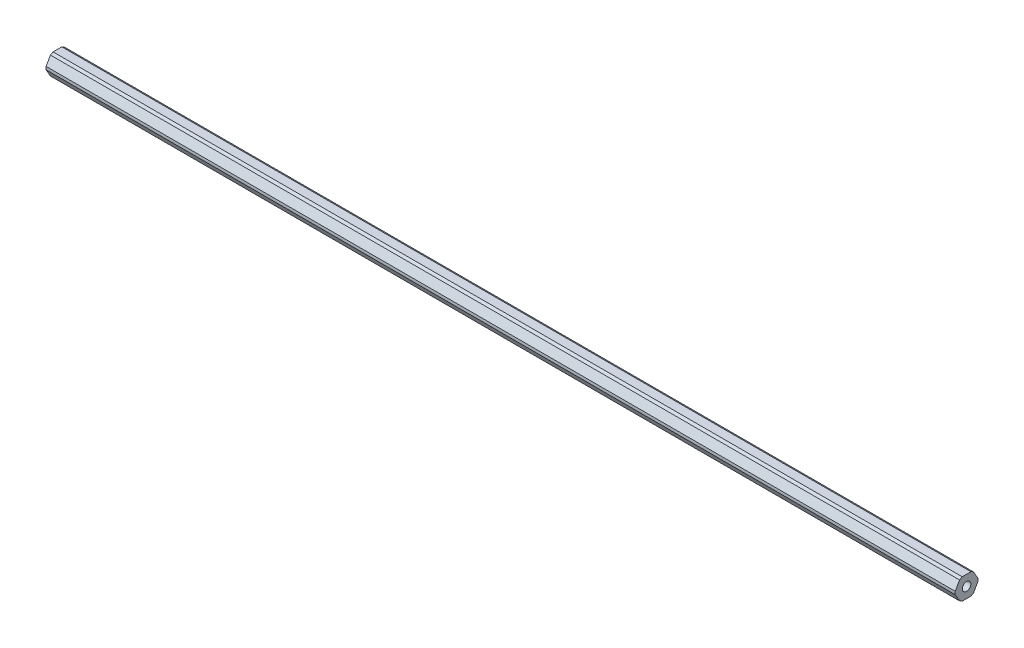
ISO-10303-21;
HEADER;
FILE_DESCRIPTION(('STEP AP214'),'2;1');
FILE_NAME('part.step','',(''),(''),'','','');
FILE_SCHEMA(('AUTOMOTIVE_DESIGN { 1 0 10303 214 1 1 1 1 }'));
ENDSEC;
DATA;
#1=APPLICATION_CONTEXT('core data for automotive mechanical design processes');
#2=APPLICATION_PROTOCOL_DEFINITION('international standard','automotive_design',2000,#1);
#3=PRODUCT_CONTEXT('',#1,'mechanical');
#4=PRODUCT('Part','Part','',(#3));
#5=PRODUCT_RELATED_PRODUCT_CATEGORY('part','',(#4));
#6=PRODUCT_DEFINITION_FORMATION('','',#4);
#7=PRODUCT_DEFINITION_CONTEXT('part definition',#1,'design');
#8=PRODUCT_DEFINITION('design','',#6,#7);
#9=PRODUCT_DEFINITION_SHAPE('','',#8);
#10=(LENGTH_UNIT() NAMED_UNIT(*) SI_UNIT(.MILLI.,.METRE.));
#11=(NAMED_UNIT(*) PLANE_ANGLE_UNIT() SI_UNIT($,.RADIAN.));
#12=(NAMED_UNIT(*) SI_UNIT($,.STERADIAN.) SOLID_ANGLE_UNIT());
#13=UNCERTAINTY_MEASURE_WITH_UNIT(LENGTH_MEASURE(1.E-05),#10,'distance_accuracy_value','');
#14=(GEOMETRIC_REPRESENTATION_CONTEXT(3) GLOBAL_UNCERTAINTY_ASSIGNED_CONTEXT((#13)) GLOBAL_UNIT_ASSIGNED_CONTEXT((#10,
#11,#12)) REPRESENTATION_CONTEXT('',''));
#15=CARTESIAN_POINT('',(0.,0.,0.));
#16=DIRECTION('',(0.,0.,1.));
#17=DIRECTION('',(1.,0.,0.));
#18=AXIS2_PLACEMENT_3D('',#15,#16,#17);
#19=CARTESIAN_POINT('',(635.,-92.0747265172785,1137.500265));
#20=DIRECTION('',(0.,-0.500000000000007,0.866025403784435));
#21=DIRECTION('',(0.,-0.866025403784435,-0.500000000000006));
#22=AXIS2_PLACEMENT_3D('',#19,#20,#21);
#23=PLANE('',#22);
#24=DIRECTION('',(-1.,0.,0.));
#25=VECTOR('',#24,1.);
#26=CARTESIAN_POINT('',(635.,-94.3555451597346,1136.18343374281));
#27=LINE('',#26,#25);
#28=CARTESIAN_POINT('',(635.,-94.3555451597345,1136.18343374281));
#29=VERTEX_POINT('',#28);
#30=CARTESIAN_POINT('',(88.9,-94.3555451597346,1136.18343374281));
#31=VERTEX_POINT('',#30);
#32=EDGE_CURVE('E164',#29,#31,#27,.T.);
#33=ORIENTED_EDGE('',*,*,#32,.T.);
#34=DIRECTION('',(0.,-0.866025403784435,-0.500000000000007));
#35=VECTOR('',#34,1.);
#36=CARTESIAN_POINT('',(88.9,-92.0747265172785,1137.500265));
#37=LINE('',#36,#35);
#38=CARTESIAN_POINT('',(88.9,-89.7939078748223,1138.81709625719));
#39=VERTEX_POINT('',#38);
#40=EDGE_CURVE('E135',#39,#31,#37,.T.);
#41=ORIENTED_EDGE('',*,*,#40,.F.);
#42=DIRECTION('',(-1.,0.,0.));
#43=VECTOR('',#42,1.);
#44=CARTESIAN_POINT('',(635.,-89.7939078748223,1138.81709625719));
#45=LINE('',#44,#43);
#46=CARTESIAN_POINT('',(635.,-89.7939078748223,1138.81709625719));
#47=VERTEX_POINT('',#46);
#48=EDGE_CURVE('E166',#39,#47,#45,.F.);
#49=ORIENTED_EDGE('',*,*,#48,.T.);
#50=DIRECTION('',(0.,0.866025403784435,0.500000000000007));
#51=VECTOR('',#50,1.);
#52=CARTESIAN_POINT('',(635.,-92.0747265172785,1137.500265));
#53=LINE('',#52,#51);
#54=EDGE_CURVE('E172',#29,#47,#53,.T.);
#55=ORIENTED_EDGE('',*,*,#54,.F.);
#56=EDGE_LOOP('',(#33,#41,#49,#55));
#57=FACE_BOUND('',#56,.T.);
#58=ADVANCED_FACE('F17',(#57),#23,.F.);
#59=CARTESIAN_POINT('',(635.,-88.8994530345568,1143.));
#60=DIRECTION('',(0.,-1.,0.));
#61=DIRECTION('',(0.,0.,-1.));
#62=AXIS2_PLACEMENT_3D('',#59,#60,#61);
#63=PLANE('',#62);
#64=DIRECTION('',(-1.,0.,0.));
#65=VECTOR('',#64,1.);
#66=CARTESIAN_POINT('',(635.,-88.8994530345568,1140.36633748561));
#67=LINE('',#66,#65);
#68=CARTESIAN_POINT('',(635.,-88.8994530345568,1140.36633748561));
#69=VERTEX_POINT('',#68);
#70=CARTESIAN_POINT('',(88.9,-88.8994530345568,1140.36633748561));
#71=VERTEX_POINT('',#70);
#72=EDGE_CURVE('E116',#69,#71,#67,.T.);
#73=ORIENTED_EDGE('',*,*,#72,.T.);
#74=DIRECTION('',(0.,0.,-1.));
#75=VECTOR('',#74,1.);
#76=CARTESIAN_POINT('',(88.9,-88.8994530345568,1143.));
#77=LINE('',#76,#75);
#78=CARTESIAN_POINT('',(88.9,-88.8994530345568,1145.63366251439));
#79=VERTEX_POINT('',#78);
#80=EDGE_CURVE('E132',#79,#71,#77,.T.);
#81=ORIENTED_EDGE('',*,*,#80,.F.);
#82=DIRECTION('',(-1.,0.,0.));
#83=VECTOR('',#82,1.);
#84=CARTESIAN_POINT('',(635.,-88.8994530345568,1145.63366251439));
#85=LINE('',#84,#83);
#86=CARTESIAN_POINT('',(635.,-88.8994530345568,1145.63366251439));
#87=VERTEX_POINT('',#86);
#88=EDGE_CURVE('E161',#79,#87,#85,.F.);
#89=ORIENTED_EDGE('',*,*,#88,.T.);
#90=DIRECTION('',(0.,0.,1.));
#91=VECTOR('',#90,1.);
#92=CARTESIAN_POINT('',(635.,-88.8994530345568,1143.));
#93=LINE('',#92,#91);
#94=EDGE_CURVE('E175',#69,#87,#93,.T.);
#95=ORIENTED_EDGE('',*,*,#94,.F.);
#96=EDGE_LOOP('',(#73,#81,#89,#95));
#97=FACE_BOUND('',#96,.T.);
#98=ADVANCED_FACE('F225',(#97),#63,.F.);
#99=CARTESIAN_POINT('',(635.,-92.0747265172784,1148.499735));
#100=DIRECTION('',(0.,-0.500000000000007,-0.866025403784435));
#101=DIRECTION('',(0.,0.866025403784435,-0.500000000000006));
#102=AXIS2_PLACEMENT_3D('',#99,#100,#101);
#103=PLANE('',#102);
#104=DIRECTION('',(-1.,0.,0.));
#105=VECTOR('',#104,1.);
#106=CARTESIAN_POINT('',(635.,-89.7939078748227,1147.18290374281));
#107=LINE('',#106,#105);
#108=CARTESIAN_POINT('',(635.,-89.7939078748227,1147.18290374281));
#109=VERTEX_POINT('',#108);
#110=CARTESIAN_POINT('',(88.9,-89.7939078748227,1147.18290374281));
#111=VERTEX_POINT('',#110);
#112=EDGE_CURVE('E117',#109,#111,#107,.T.);
#113=ORIENTED_EDGE('',*,*,#112,.T.);
#114=DIRECTION('',(0.,0.866025403784435,-0.500000000000007));
#115=VECTOR('',#114,1.);
#116=CARTESIAN_POINT('',(88.9,-92.0747265172784,1148.499735));
#117=LINE('',#116,#115);
#118=CARTESIAN_POINT('',(88.9,-94.355545159734,1149.81656625719));
#119=VERTEX_POINT('',#118);
#120=EDGE_CURVE('E123',#119,#111,#117,.T.);
#121=ORIENTED_EDGE('',*,*,#120,.F.);
#122=DIRECTION('',(-1.,0.,0.));
#123=VECTOR('',#122,1.);
#124=CARTESIAN_POINT('',(635.,-94.355545159734,1149.81656625719));
#125=LINE('',#124,#123);
#126=CARTESIAN_POINT('',(635.,-94.355545159734,1149.81656625719));
#127=VERTEX_POINT('',#126);
#128=EDGE_CURVE('E105',#119,#127,#125,.F.);
#129=ORIENTED_EDGE('',*,*,#128,.T.);
#130=DIRECTION('',(0.,-0.866025403784435,0.500000000000007));
#131=VECTOR('',#130,1.);
#132=CARTESIAN_POINT('',(635.,-92.0747265172784,1148.499735));
#133=LINE('',#132,#131);
#134=EDGE_CURVE('E178',#109,#127,#133,.T.);
#135=ORIENTED_EDGE('',*,*,#134,.F.);
#136=EDGE_LOOP('',(#113,#121,#129,#135));
#137=FACE_BOUND('',#136,.T.);
#138=ADVANCED_FACE('F130',(#137),#103,.F.);
#139=CARTESIAN_POINT('',(635.,-98.4252734827217,1148.499735));
#140=DIRECTION('',(0.,0.500000000000007,-0.866025403784435));
#141=DIRECTION('',(0.,0.866025403784435,0.500000000000006));
#142=AXIS2_PLACEMENT_3D('',#139,#140,#141);
#143=PLANE('',#142);
#144=DIRECTION('',(-1.,0.,0.));
#145=VECTOR('',#144,1.);
#146=CARTESIAN_POINT('',(635.,-96.1444548402661,1149.81656625719));
#147=LINE('',#146,#145);
#148=CARTESIAN_POINT('',(635.,-96.144454840266,1149.81656625719));
#149=VERTEX_POINT('',#148);
#150=CARTESIAN_POINT('',(88.9,-96.144454840266,1149.81656625719));
#151=VERTEX_POINT('',#150);
#152=EDGE_CURVE('E154',#149,#151,#147,.T.);
#153=ORIENTED_EDGE('',*,*,#152,.T.);
#154=DIRECTION('',(0.,0.866025403784435,0.500000000000007));
#155=VECTOR('',#154,1.);
#156=CARTESIAN_POINT('',(88.9,-98.4252734827217,1148.499735));
#157=LINE('',#156,#155);
#158=CARTESIAN_POINT('',(88.9,-100.706092125177,1147.18290374281));
#159=VERTEX_POINT('',#158);
#160=EDGE_CURVE('E126',#159,#151,#157,.T.);
#161=ORIENTED_EDGE('',*,*,#160,.F.);
#162=DIRECTION('',(-1.,0.,0.));
#163=VECTOR('',#162,1.);
#164=CARTESIAN_POINT('',(635.,-100.706092125177,1147.18290374281));
#165=LINE('',#164,#163);
#166=CARTESIAN_POINT('',(635.,-100.706092125177,1147.18290374281));
#167=VERTEX_POINT('',#166);
#168=EDGE_CURVE('E156',#159,#167,#165,.F.);
#169=ORIENTED_EDGE('',*,*,#168,.T.);
#170=DIRECTION('',(0.,-0.866025403784435,-0.500000000000007));
#171=VECTOR('',#170,1.);
#172=CARTESIAN_POINT('',(635.,-98.4252734827217,1148.499735));
#173=LINE('',#172,#171);
#174=EDGE_CURVE('E180',#149,#167,#173,.T.);
#175=ORIENTED_EDGE('',*,*,#174,.F.);
#176=EDGE_LOOP('',(#153,#161,#169,#175));
#177=FACE_BOUND('',#176,.T.);
#178=ADVANCED_FACE('F230',(#177),#143,.F.);
#179=CARTESIAN_POINT('',(635.,-101.600546965443,1143.));
#180=DIRECTION('',(0.,1.,0.));
#181=DIRECTION('',(0.,0.,1.));
#182=AXIS2_PLACEMENT_3D('',#179,#180,#181);
#183=PLANE('',#182);
#184=DIRECTION('',(-1.,0.,0.));
#185=VECTOR('',#184,1.);
#186=CARTESIAN_POINT('',(635.,-101.600546965443,1145.63366251439));
#187=LINE('',#186,#185);
#188=CARTESIAN_POINT('',(635.,-101.600546965443,1145.63366251439));
#189=VERTEX_POINT('',#188);
#190=CARTESIAN_POINT('',(88.9,-101.600546965443,1145.63366251439));
#191=VERTEX_POINT('',#190);
#192=EDGE_CURVE('E149',#189,#191,#187,.T.);
#193=ORIENTED_EDGE('',*,*,#192,.T.);
#194=DIRECTION('',(0.,0.,1.));
#195=VECTOR('',#194,1.);
#196=CARTESIAN_POINT('',(88.9,-101.600546965443,1143.));
#197=LINE('',#196,#195);
#198=CARTESIAN_POINT('',(88.9,-101.600546965443,1140.36633748561));
#199=VERTEX_POINT('',#198);
#200=EDGE_CURVE('E137',#199,#191,#197,.T.);
#201=ORIENTED_EDGE('',*,*,#200,.F.);
#202=DIRECTION('',(-1.,0.,0.));
#203=VECTOR('',#202,1.);
#204=CARTESIAN_POINT('',(635.,-101.600546965443,1140.36633748561));
#205=LINE('',#204,#203);
#206=CARTESIAN_POINT('',(635.,-101.600546965443,1140.36633748561));
#207=VERTEX_POINT('',#206);
#208=EDGE_CURVE('E151',#199,#207,#205,.F.);
#209=ORIENTED_EDGE('',*,*,#208,.T.);
#210=DIRECTION('',(0.,0.,-1.));
#211=VECTOR('',#210,1.);
#212=CARTESIAN_POINT('',(635.,-101.600546965443,1143.));
#213=LINE('',#212,#211);
#214=EDGE_CURVE('E24',#189,#207,#213,.T.);
#215=ORIENTED_EDGE('',*,*,#214,.F.);
#216=EDGE_LOOP('',(#193,#201,#209,#215));
#217=FACE_BOUND('',#216,.T.);
#218=ADVANCED_FACE('F190',(#217),#183,.F.);
#219=CARTESIAN_POINT('',(635.,-98.4252734827216,1137.500265));
#220=DIRECTION('',(0.,0.500000000000007,0.866025403784435));
#221=DIRECTION('',(0.,-0.866025403784435,0.500000000000006));
#222=AXIS2_PLACEMENT_3D('',#219,#220,#221);
#223=PLANE('',#222);
#224=DIRECTION('',(-1.,0.,0.));
#225=VECTOR('',#224,1.);
#226=CARTESIAN_POINT('',(635.,-100.706092125178,1138.81709625719));
#227=LINE('',#226,#225);
#228=CARTESIAN_POINT('',(635.,-100.706092125178,1138.81709625719));
#229=VERTEX_POINT('',#228);
#230=CARTESIAN_POINT('',(88.9,-100.706092125178,1138.81709625719));
#231=VERTEX_POINT('',#230);
#232=EDGE_CURVE('E39',#229,#231,#227,.T.);
#233=ORIENTED_EDGE('',*,*,#232,.T.);
#234=DIRECTION('',(0.,-0.866025403784435,0.500000000000007));
#235=VECTOR('',#234,1.);
#236=CARTESIAN_POINT('',(88.9,-98.4252734827216,1137.500265));
#237=LINE('',#236,#235);
#238=CARTESIAN_POINT('',(88.9,-96.1444548402655,1136.18343374281));
#239=VERTEX_POINT('',#238);
#240=EDGE_CURVE('E200',#239,#231,#237,.T.);
#241=ORIENTED_EDGE('',*,*,#240,.F.);
#242=DIRECTION('',(-1.,0.,0.));
#243=VECTOR('',#242,1.);
#244=CARTESIAN_POINT('',(635.,-96.1444548402655,1136.18343374281));
#245=LINE('',#244,#243);
#246=CARTESIAN_POINT('',(635.,-96.1444548402655,1136.18343374281));
#247=VERTEX_POINT('',#246);
#248=EDGE_CURVE('E147',#239,#247,#245,.F.);
#249=ORIENTED_EDGE('',*,*,#248,.T.);
#250=DIRECTION('',(0.,0.866025403784435,-0.500000000000007));
#251=VECTOR('',#250,1.);
#252=CARTESIAN_POINT('',(635.,-98.4252734827216,1137.500265));
#253=LINE('',#252,#251);
#254=EDGE_CURVE('E11',#229,#247,#253,.T.);
#255=ORIENTED_EDGE('',*,*,#254,.F.);
#256=EDGE_LOOP('',(#233,#241,#249,#255));
#257=FACE_BOUND('',#256,.T.);
#258=ADVANCED_FACE('F219',(#257),#223,.F.);
#259=CARTESIAN_POINT('',(635.,-95.25,1143.));
#260=DIRECTION('',(1.,0.,0.));
#261=DIRECTION('',(0.,0.,-1.));
#262=AXIS2_PLACEMENT_3D('',#259,#260,#261);
#263=PLANE('',#262);
#264=CARTESIAN_POINT('',(635.,-95.25,1143.));
#265=DIRECTION('',(1.,0.,0.));
#266=DIRECTION('',(0.,0.,-1.));
#267=AXIS2_PLACEMENT_3D('',#264,#265,#266);
#268=CIRCLE('',#267,2.55270000000008);
#269=CARTESIAN_POINT('',(635.,-95.25,1140.4473));
#270=VERTEX_POINT('',#269);
#271=EDGE_CURVE('E169',#270,#270,#268,.T.);
#272=ORIENTED_EDGE('',*,*,#271,.F.);
#273=EDGE_LOOP('',(#272));
#274=FACE_BOUND('',#273,.T.);
#275=ORIENTED_EDGE('',*,*,#54,.T.);
#276=CARTESIAN_POINT('',(635.,-95.25,1143.));
#277=DIRECTION('',(1.,0.,0.));
#278=DIRECTION('',(0.,0.,-1.));
#279=AXIS2_PLACEMENT_3D('',#276,#277,#278);
#280=CIRCLE('',#279,6.875);
#281=EDGE_CURVE('E145',#47,#69,#280,.T.);
#282=ORIENTED_EDGE('',*,*,#281,.T.);
#283=ORIENTED_EDGE('',*,*,#94,.T.);
#284=EDGE_CURVE('E223',#87,#109,#280,.T.);
#285=ORIENTED_EDGE('',*,*,#284,.T.);
#286=ORIENTED_EDGE('',*,*,#134,.T.);
#287=EDGE_CURVE('E111',#127,#149,#280,.T.);
#288=ORIENTED_EDGE('',*,*,#287,.T.);
#289=ORIENTED_EDGE('',*,*,#174,.T.);
#290=EDGE_CURVE('E188',#167,#189,#280,.T.);
#291=ORIENTED_EDGE('',*,*,#290,.T.);
#292=ORIENTED_EDGE('',*,*,#214,.T.);
#293=EDGE_CURVE('E144',#207,#229,#280,.T.);
#294=ORIENTED_EDGE('',*,*,#293,.T.);
#295=ORIENTED_EDGE('',*,*,#254,.T.);
#296=EDGE_CURVE('E31',#247,#29,#280,.T.);
#297=ORIENTED_EDGE('',*,*,#296,.T.);
#298=EDGE_LOOP('',(#275,#282,#283,#285,#286,#288,#289,#291,#292,#294,#295,#297));
#299=FACE_BOUND('',#298,.T.);
#300=ADVANCED_FACE('F186',(#274,#299),#263,.T.);
#301=CARTESIAN_POINT('',(635.,-95.25,1143.));
#302=DIRECTION('',(-1.,0.,0.));
#303=DIRECTION('',(0.,0.,1.));
#304=AXIS2_PLACEMENT_3D('',#301,#302,#303);
#305=CYLINDRICAL_SURFACE('',#304,2.55270000000008);
#306=ORIENTED_EDGE('',*,*,#271,.T.);
#307=EDGE_LOOP('',(#306));
#308=FACE_BOUND('',#307,.T.);
#309=CARTESIAN_POINT('',(88.9,-95.25,1143.));
#310=DIRECTION('',(-1.,0.,0.));
#311=DIRECTION('',(0.,0.,1.));
#312=AXIS2_PLACEMENT_3D('',#309,#310,#311);
#313=CIRCLE('',#312,2.55270000000008);
#314=CARTESIAN_POINT('',(88.9,-95.25,1145.5527));
#315=VERTEX_POINT('',#314);
#316=EDGE_CURVE('E204',#315,#315,#313,.T.);
#317=ORIENTED_EDGE('',*,*,#316,.T.);
#318=EDGE_LOOP('',(#317));
#319=FACE_BOUND('',#318,.T.);
#320=ADVANCED_FACE('F244',(#308,#319),#305,.F.);
#321=CARTESIAN_POINT('',(635.,-95.25,1143.));
#322=DIRECTION('',(-1.,0.,0.));
#323=DIRECTION('',(0.,0.,1.));
#324=AXIS2_PLACEMENT_3D('',#321,#322,#323);
#325=CYLINDRICAL_SURFACE('',#324,6.875);
#326=ORIENTED_EDGE('',*,*,#208,.F.);
#327=CARTESIAN_POINT('',(88.9,-95.25,1143.));
#328=DIRECTION('',(-1.,0.,0.));
#329=DIRECTION('',(0.,0.,1.));
#330=AXIS2_PLACEMENT_3D('',#327,#328,#329);
#331=CIRCLE('',#330,6.875);
#332=EDGE_CURVE('E196',#231,#199,#331,.T.);
#333=ORIENTED_EDGE('',*,*,#332,.F.);
#334=ORIENTED_EDGE('',*,*,#232,.F.);
#335=ORIENTED_EDGE('',*,*,#293,.F.);
#336=EDGE_LOOP('',(#326,#333,#334,#335));
#337=FACE_BOUND('',#336,.T.);
#338=ADVANCED_FACE('F195',(#337),#325,.T.);
#339=ORIENTED_EDGE('',*,*,#296,.F.);
#340=ORIENTED_EDGE('',*,*,#248,.F.);
#341=EDGE_CURVE('E201',#31,#239,#331,.T.);
#342=ORIENTED_EDGE('',*,*,#341,.F.);
#343=ORIENTED_EDGE('',*,*,#32,.F.);
#344=EDGE_LOOP('',(#339,#340,#342,#343));
#345=FACE_BOUND('',#344,.T.);
#346=ADVANCED_FACE('F217',(#345),#325,.T.);
#347=ORIENTED_EDGE('',*,*,#168,.F.);
#348=EDGE_CURVE('E127',#191,#159,#331,.T.);
#349=ORIENTED_EDGE('',*,*,#348,.F.);
#350=ORIENTED_EDGE('',*,*,#192,.F.);
#351=ORIENTED_EDGE('',*,*,#290,.F.);
#352=EDGE_LOOP('',(#347,#349,#350,#351));
#353=FACE_BOUND('',#352,.T.);
#354=ADVANCED_FACE('F232',(#353),#325,.T.);
#355=ORIENTED_EDGE('',*,*,#128,.F.);
#356=EDGE_CURVE('E108',#151,#119,#331,.T.);
#357=ORIENTED_EDGE('',*,*,#356,.F.);
#358=ORIENTED_EDGE('',*,*,#152,.F.);
#359=ORIENTED_EDGE('',*,*,#287,.F.);
#360=EDGE_LOOP('',(#355,#357,#358,#359));
#361=FACE_BOUND('',#360,.T.);
#362=ADVANCED_FACE('F107',(#361),#325,.T.);
#363=ORIENTED_EDGE('',*,*,#88,.F.);
#364=EDGE_CURVE('E129',#111,#79,#331,.T.);
#365=ORIENTED_EDGE('',*,*,#364,.F.);
#366=ORIENTED_EDGE('',*,*,#112,.F.);
#367=ORIENTED_EDGE('',*,*,#284,.F.);
#368=EDGE_LOOP('',(#363,#365,#366,#367));
#369=FACE_BOUND('',#368,.T.);
#370=ADVANCED_FACE('F227',(#369),#325,.T.);
#371=ORIENTED_EDGE('',*,*,#48,.F.);
#372=EDGE_CURVE('E202',#71,#39,#331,.T.);
#373=ORIENTED_EDGE('',*,*,#372,.F.);
#374=ORIENTED_EDGE('',*,*,#72,.F.);
#375=ORIENTED_EDGE('',*,*,#281,.F.);
#376=EDGE_LOOP('',(#371,#373,#374,#375));
#377=FACE_BOUND('',#376,.T.);
#378=ADVANCED_FACE('F240',(#377),#325,.T.);
#379=CARTESIAN_POINT('',(88.9,-95.25,1143.));
#380=DIRECTION('',(-1.,0.,0.));
#381=DIRECTION('',(0.,0.,-1.));
#382=AXIS2_PLACEMENT_3D('',#379,#380,#381);
#383=PLANE('',#382);
#384=ORIENTED_EDGE('',*,*,#316,.F.);
#385=EDGE_LOOP('',(#384));
#386=FACE_BOUND('',#385,.T.);
#387=ORIENTED_EDGE('',*,*,#120,.T.);
#388=ORIENTED_EDGE('',*,*,#364,.T.);
#389=ORIENTED_EDGE('',*,*,#80,.T.);
#390=ORIENTED_EDGE('',*,*,#372,.T.);
#391=ORIENTED_EDGE('',*,*,#40,.T.);
#392=ORIENTED_EDGE('',*,*,#341,.T.);
#393=ORIENTED_EDGE('',*,*,#240,.T.);
#394=ORIENTED_EDGE('',*,*,#332,.T.);
#395=ORIENTED_EDGE('',*,*,#200,.T.);
#396=ORIENTED_EDGE('',*,*,#348,.T.);
#397=ORIENTED_EDGE('',*,*,#160,.T.);
#398=ORIENTED_EDGE('',*,*,#356,.T.);
#399=EDGE_LOOP('',(#387,#388,#389,#390,#391,#392,#393,#394,#395,#396,#397,#398));
#400=FACE_BOUND('',#399,.T.);
#401=ADVANCED_FACE('F121',(#386,#400),#383,.T.);
#402=CLOSED_SHELL('',(#58,#98,#138,#178,#218,#258,#300,#320,#338,#346,#354,#362,#370,#378,#401));
#403=MANIFOLD_SOLID_BREP('B1',#402);
#404=ADVANCED_BREP_SHAPE_REPRESENTATION('',(#18,#403),#14);
#405=SHAPE_DEFINITION_REPRESENTATION(#9,#404);
ENDSEC;
END-ISO-10303-21;
